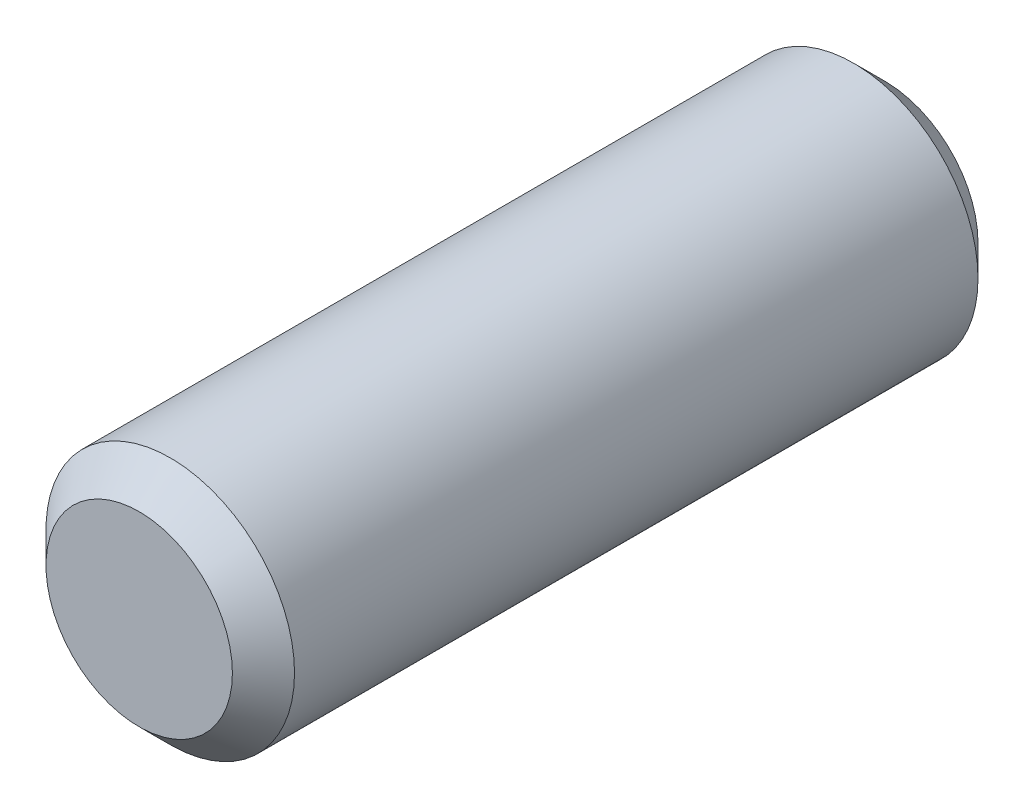
ISO-10303-21;
HEADER;
FILE_DESCRIPTION(('STEP AP214'),'2;1');
FILE_NAME('part.step','',(''),(''),'','','');
FILE_SCHEMA(('AUTOMOTIVE_DESIGN { 1 0 10303 214 1 1 1 1 }'));
ENDSEC;
DATA;
#1=APPLICATION_CONTEXT('core data for automotive mechanical design processes');
#2=APPLICATION_PROTOCOL_DEFINITION('international standard','automotive_design',2000,#1);
#3=PRODUCT_CONTEXT('',#1,'mechanical');
#4=PRODUCT('Part','Part','',(#3));
#5=PRODUCT_RELATED_PRODUCT_CATEGORY('part','',(#4));
#6=PRODUCT_DEFINITION_FORMATION('','',#4);
#7=PRODUCT_DEFINITION_CONTEXT('part definition',#1,'design');
#8=PRODUCT_DEFINITION('design','',#6,#7);
#9=PRODUCT_DEFINITION_SHAPE('','',#8);
#10=(LENGTH_UNIT() NAMED_UNIT(*) SI_UNIT(.MILLI.,.METRE.));
#11=(NAMED_UNIT(*) PLANE_ANGLE_UNIT() SI_UNIT($,.RADIAN.));
#12=(NAMED_UNIT(*) SI_UNIT($,.STERADIAN.) SOLID_ANGLE_UNIT());
#13=UNCERTAINTY_MEASURE_WITH_UNIT(LENGTH_MEASURE(1.E-05),#10,'distance_accuracy_value','');
#14=(GEOMETRIC_REPRESENTATION_CONTEXT(3) GLOBAL_UNCERTAINTY_ASSIGNED_CONTEXT((#13)) GLOBAL_UNIT_ASSIGNED_CONTEXT((#10,
#11,#12)) REPRESENTATION_CONTEXT('',''));
#15=CARTESIAN_POINT('',(0.,0.,0.));
#16=DIRECTION('',(0.,0.,1.));
#17=DIRECTION('',(1.,0.,0.));
#18=AXIS2_PLACEMENT_3D('',#15,#16,#17);
#19=CARTESIAN_POINT('',(0.,0.,6.));
#20=DIRECTION('',(0.,0.,-1.));
#21=DIRECTION('',(-1.,0.,0.));
#22=AXIS2_PLACEMENT_3D('',#19,#20,#21);
#23=CYLINDRICAL_SURFACE('',#22,2.);
#24=CARTESIAN_POINT('',(0.,0.,-5.5));
#25=DIRECTION('',(0.,0.,1.));
#26=DIRECTION('',(1.,0.,0.));
#27=AXIS2_PLACEMENT_3D('',#24,#25,#26);
#28=CIRCLE('',#27,2.);
#29=CARTESIAN_POINT('',(2.,0.,-5.5));
#30=VERTEX_POINT('',#29);
#31=EDGE_CURVE('E53',#30,#30,#28,.T.);
#32=ORIENTED_EDGE('',*,*,#31,.T.);
#33=EDGE_LOOP('',(#32));
#34=FACE_BOUND('',#33,.T.);
#35=CARTESIAN_POINT('',(0.,0.,5.5));
#36=DIRECTION('',(0.,0.,1.));
#37=DIRECTION('',(1.,0.,0.));
#38=AXIS2_PLACEMENT_3D('',#35,#36,#37);
#39=CIRCLE('',#38,2.);
#40=CARTESIAN_POINT('',(2.,0.,5.5));
#41=VERTEX_POINT('',#40);
#42=EDGE_CURVE('E57',#41,#41,#39,.F.);
#43=ORIENTED_EDGE('',*,*,#42,.T.);
#44=EDGE_LOOP('',(#43));
#45=FACE_BOUND('',#44,.T.);
#46=ADVANCED_FACE('F41',(#34,#45),#23,.T.);
#47=CARTESIAN_POINT('',(0.,0.,6.));
#48=DIRECTION('',(0.,0.,1.));
#49=DIRECTION('',(1.,0.,0.));
#50=AXIS2_PLACEMENT_3D('',#47,#48,#49);
#51=PLANE('',#50);
#52=CARTESIAN_POINT('',(0.,0.,6.));
#53=DIRECTION('',(0.,0.,1.));
#54=DIRECTION('',(1.,0.,0.));
#55=AXIS2_PLACEMENT_3D('',#52,#53,#54);
#56=CIRCLE('',#55,1.5);
#57=CARTESIAN_POINT('',(1.5,0.,6.));
#58=VERTEX_POINT('',#57);
#59=EDGE_CURVE('E10',#58,#58,#56,.T.);
#60=ORIENTED_EDGE('',*,*,#59,.T.);
#61=EDGE_LOOP('',(#60));
#62=FACE_BOUND('',#61,.T.);
#63=ADVANCED_FACE('F73',(#62),#51,.T.);
#64=CARTESIAN_POINT('',(0.,0.,-6.));
#65=DIRECTION('',(0.,0.,1.));
#66=DIRECTION('',(1.,0.,0.));
#67=AXIS2_PLACEMENT_3D('',#64,#65,#66);
#68=PLANE('',#67);
#69=CARTESIAN_POINT('',(0.,0.,-6.));
#70=DIRECTION('',(0.,0.,1.));
#71=DIRECTION('',(1.,0.,0.));
#72=AXIS2_PLACEMENT_3D('',#69,#70,#71);
#73=CIRCLE('',#72,1.5);
#74=CARTESIAN_POINT('',(1.5,0.,-6.));
#75=VERTEX_POINT('',#74);
#76=EDGE_CURVE('E49',#75,#75,#73,.F.);
#77=ORIENTED_EDGE('',*,*,#76,.T.);
#78=EDGE_LOOP('',(#77));
#79=FACE_BOUND('',#78,.T.);
#80=ADVANCED_FACE('F70',(#79),#68,.F.);
#81=CARTESIAN_POINT('',(0.,0.,-5.5));
#82=DIRECTION('',(0.,0.,1.));
#83=DIRECTION('',(1.,0.,0.));
#84=AXIS2_PLACEMENT_3D('',#81,#82,#83);
#85=CONICAL_SURFACE('',#84,2.,0.78539816339745);
#86=ORIENTED_EDGE('',*,*,#76,.F.);
#87=EDGE_LOOP('',(#86));
#88=FACE_BOUND('',#87,.T.);
#89=ORIENTED_EDGE('',*,*,#31,.F.);
#90=EDGE_LOOP('',(#89));
#91=FACE_BOUND('',#90,.T.);
#92=ADVANCED_FACE('F66',(#88,#91),#85,.T.);
#93=CARTESIAN_POINT('',(0.,0.,6.));
#94=DIRECTION('',(0.,0.,-1.));
#95=DIRECTION('',(-1.,0.,0.));
#96=AXIS2_PLACEMENT_3D('',#93,#94,#95);
#97=CONICAL_SURFACE('',#96,1.5,0.785398163397447);
#98=ORIENTED_EDGE('',*,*,#42,.F.);
#99=EDGE_LOOP('',(#98));
#100=FACE_BOUND('',#99,.T.);
#101=ORIENTED_EDGE('',*,*,#59,.F.);
#102=EDGE_LOOP('',(#101));
#103=FACE_BOUND('',#102,.T.);
#104=ADVANCED_FACE('F44',(#100,#103),#97,.T.);
#105=CLOSED_SHELL('',(#46,#63,#80,#92,#104));
#106=MANIFOLD_SOLID_BREP('B2',#105);
#107=ADVANCED_BREP_SHAPE_REPRESENTATION('',(#18,#106),#14);
#108=SHAPE_DEFINITION_REPRESENTATION(#9,#107);
ENDSEC;
END-ISO-10303-21;
